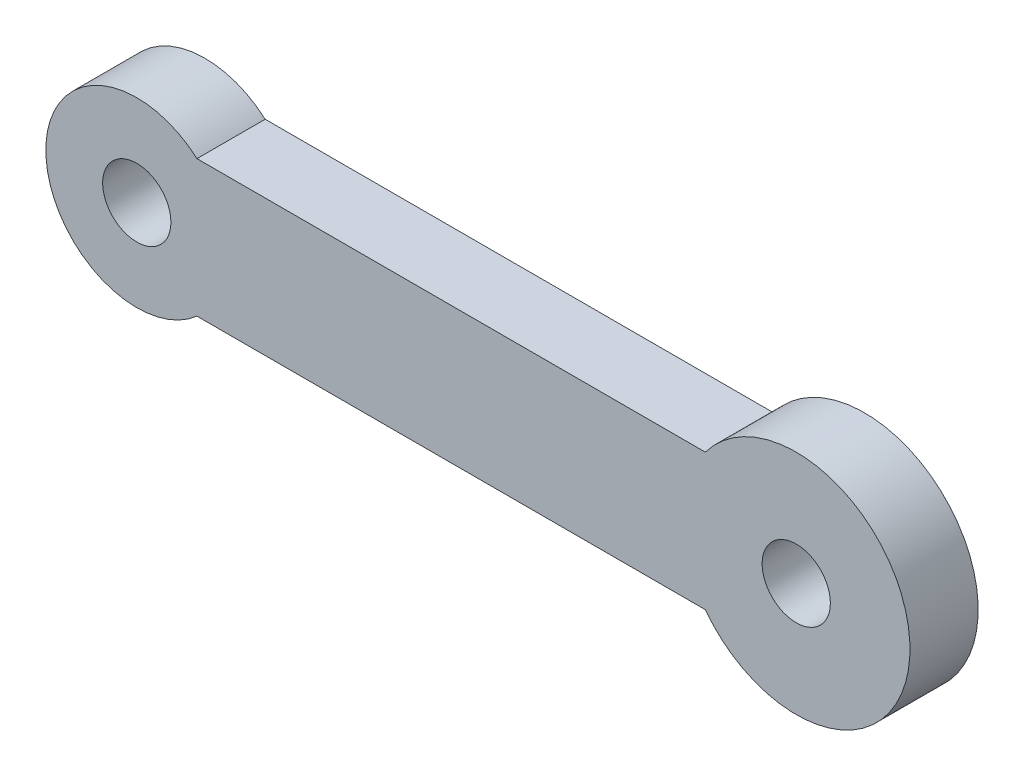
ISO-10303-21;
HEADER;
FILE_DESCRIPTION(('STEP AP214'),'2;1');
FILE_NAME('part.step','',(''),(''),'','','');
FILE_SCHEMA(('AUTOMOTIVE_DESIGN { 1 0 10303 214 1 1 1 1 }'));
ENDSEC;
DATA;
#1=APPLICATION_CONTEXT('core data for automotive mechanical design processes');
#2=APPLICATION_PROTOCOL_DEFINITION('international standard','automotive_design',2000,#1);
#3=PRODUCT_CONTEXT('',#1,'mechanical');
#4=PRODUCT('Part','Part','',(#3));
#5=PRODUCT_RELATED_PRODUCT_CATEGORY('part','',(#4));
#6=PRODUCT_DEFINITION_FORMATION('','',#4);
#7=PRODUCT_DEFINITION_CONTEXT('part definition',#1,'design');
#8=PRODUCT_DEFINITION('design','',#6,#7);
#9=PRODUCT_DEFINITION_SHAPE('','',#8);
#10=(LENGTH_UNIT() NAMED_UNIT(*) SI_UNIT(.MILLI.,.METRE.));
#11=(NAMED_UNIT(*) PLANE_ANGLE_UNIT() SI_UNIT($,.RADIAN.));
#12=(NAMED_UNIT(*) SI_UNIT($,.STERADIAN.) SOLID_ANGLE_UNIT());
#13=UNCERTAINTY_MEASURE_WITH_UNIT(LENGTH_MEASURE(1.E-05),#10,'distance_accuracy_value','');
#14=(GEOMETRIC_REPRESENTATION_CONTEXT(3) GLOBAL_UNCERTAINTY_ASSIGNED_CONTEXT((#13)) GLOBAL_UNIT_ASSIGNED_CONTEXT((#10,
#11,#12)) REPRESENTATION_CONTEXT('',''));
#15=CARTESIAN_POINT('',(0.,0.,0.));
#16=DIRECTION('',(0.,0.,1.));
#17=DIRECTION('',(1.,0.,0.));
#18=AXIS2_PLACEMENT_3D('',#15,#16,#17);
#19=CARTESIAN_POINT('',(0.,0.,3.));
#20=DIRECTION('',(0.,0.,-1.));
#21=DIRECTION('',(-1.,0.,0.));
#22=AXIS2_PLACEMENT_3D('',#19,#20,#21);
#23=CYLINDRICAL_SURFACE('',#22,4.);
#24=CARTESIAN_POINT('',(0.,0.,0.));
#25=DIRECTION('',(0.,0.,1.));
#26=DIRECTION('',(1.,0.,0.));
#27=AXIS2_PLACEMENT_3D('',#24,#25,#26);
#28=CIRCLE('',#27,4.);
#29=CARTESIAN_POINT('',(2.64575131106459,3.,0.));
#30=VERTEX_POINT('',#29);
#31=CARTESIAN_POINT('',(2.64575131106459,-3.,0.));
#32=VERTEX_POINT('',#31);
#33=EDGE_CURVE('E111',#30,#32,#28,.T.);
#34=ORIENTED_EDGE('',*,*,#33,.T.);
#35=DIRECTION('',(0.,0.,-1.));
#36=VECTOR('',#35,1.);
#37=CARTESIAN_POINT('',(2.64575131106459,-3.,3.));
#38=LINE('',#37,#36);
#39=CARTESIAN_POINT('',(2.64575131106459,-3.,3.));
#40=VERTEX_POINT('',#39);
#41=EDGE_CURVE('E11',#40,#32,#38,.T.);
#42=ORIENTED_EDGE('',*,*,#41,.F.);
#43=CARTESIAN_POINT('',(0.,0.,3.));
#44=DIRECTION('',(0.,0.,1.));
#45=DIRECTION('',(1.,0.,0.));
#46=AXIS2_PLACEMENT_3D('',#43,#44,#45);
#47=CIRCLE('',#46,4.);
#48=CARTESIAN_POINT('',(2.64575131106459,3.,3.));
#49=VERTEX_POINT('',#48);
#50=EDGE_CURVE('E91',#49,#40,#47,.T.);
#51=ORIENTED_EDGE('',*,*,#50,.F.);
#52=DIRECTION('',(0.,0.,-1.));
#53=VECTOR('',#52,1.);
#54=CARTESIAN_POINT('',(2.64575131106459,3.,3.));
#55=LINE('',#54,#53);
#56=EDGE_CURVE('E57',#49,#30,#55,.T.);
#57=ORIENTED_EDGE('',*,*,#56,.T.);
#58=EDGE_LOOP('',(#34,#42,#51,#57));
#59=FACE_BOUND('',#58,.T.);
#60=ADVANCED_FACE('F40',(#59),#23,.T.);
#61=CARTESIAN_POINT('',(0.,-3.,3.));
#62=DIRECTION('',(0.,1.,0.));
#63=DIRECTION('',(0.,0.,1.));
#64=AXIS2_PLACEMENT_3D('',#61,#62,#63);
#65=PLANE('',#64);
#66=DIRECTION('',(1.,0.,0.));
#67=VECTOR('',#66,1.);
#68=CARTESIAN_POINT('',(0.,-3.,0.));
#69=LINE('',#68,#67);
#70=CARTESIAN_POINT('',(25.,-3.,0.));
#71=VERTEX_POINT('',#70);
#72=EDGE_CURVE('E96',#32,#71,#69,.T.);
#73=ORIENTED_EDGE('',*,*,#72,.T.);
#74=DIRECTION('',(0.,0.,-1.));
#75=VECTOR('',#74,1.);
#76=CARTESIAN_POINT('',(25.,-3.,3.));
#77=LINE('',#76,#75);
#78=CARTESIAN_POINT('',(25.,-3.,3.));
#79=VERTEX_POINT('',#78);
#80=EDGE_CURVE('E49',#79,#71,#77,.T.);
#81=ORIENTED_EDGE('',*,*,#80,.F.);
#82=DIRECTION('',(1.,0.,0.));
#83=VECTOR('',#82,1.);
#84=CARTESIAN_POINT('',(0.,-3.,3.));
#85=LINE('',#84,#83);
#86=EDGE_CURVE('E83',#40,#79,#85,.T.);
#87=ORIENTED_EDGE('',*,*,#86,.F.);
#88=ORIENTED_EDGE('',*,*,#41,.T.);
#89=EDGE_LOOP('',(#73,#81,#87,#88));
#90=FACE_BOUND('',#89,.T.);
#91=ADVANCED_FACE('F95',(#90),#65,.F.);
#92=CARTESIAN_POINT('',(29.,0.,3.));
#93=DIRECTION('',(0.,0.,-1.));
#94=DIRECTION('',(-1.,0.,0.));
#95=AXIS2_PLACEMENT_3D('',#92,#93,#94);
#96=CYLINDRICAL_SURFACE('',#95,5.);
#97=CARTESIAN_POINT('',(29.,0.,0.));
#98=DIRECTION('',(0.,0.,1.));
#99=DIRECTION('',(1.,0.,0.));
#100=AXIS2_PLACEMENT_3D('',#97,#98,#99);
#101=CIRCLE('',#100,5.);
#102=CARTESIAN_POINT('',(25.,3.,0.));
#103=VERTEX_POINT('',#102);
#104=EDGE_CURVE('E114',#71,#103,#101,.T.);
#105=ORIENTED_EDGE('',*,*,#104,.T.);
#106=DIRECTION('',(0.,0.,-1.));
#107=VECTOR('',#106,1.);
#108=CARTESIAN_POINT('',(25.,3.,3.));
#109=LINE('',#108,#107);
#110=CARTESIAN_POINT('',(25.,3.,3.));
#111=VERTEX_POINT('',#110);
#112=EDGE_CURVE('E72',#111,#103,#109,.T.);
#113=ORIENTED_EDGE('',*,*,#112,.F.);
#114=CARTESIAN_POINT('',(29.,0.,3.));
#115=DIRECTION('',(0.,0.,1.));
#116=DIRECTION('',(1.,0.,0.));
#117=AXIS2_PLACEMENT_3D('',#114,#115,#116);
#118=CIRCLE('',#117,5.);
#119=EDGE_CURVE('E90',#79,#111,#118,.T.);
#120=ORIENTED_EDGE('',*,*,#119,.F.);
#121=ORIENTED_EDGE('',*,*,#80,.T.);
#122=EDGE_LOOP('',(#105,#113,#120,#121));
#123=FACE_BOUND('',#122,.T.);
#124=ADVANCED_FACE('F99',(#123),#96,.T.);
#125=CARTESIAN_POINT('',(0.,3.,3.));
#126=DIRECTION('',(0.,1.,0.));
#127=DIRECTION('',(0.,0.,1.));
#128=AXIS2_PLACEMENT_3D('',#125,#126,#127);
#129=PLANE('',#128);
#130=DIRECTION('',(1.,0.,0.));
#131=VECTOR('',#130,1.);
#132=CARTESIAN_POINT('',(0.,3.,0.));
#133=LINE('',#132,#131);
#134=EDGE_CURVE('E116',#30,#103,#133,.T.);
#135=ORIENTED_EDGE('',*,*,#134,.F.);
#136=ORIENTED_EDGE('',*,*,#56,.F.);
#137=DIRECTION('',(1.,0.,0.));
#138=VECTOR('',#137,1.);
#139=CARTESIAN_POINT('',(0.,3.,3.));
#140=LINE('',#139,#138);
#141=EDGE_CURVE('E100',#49,#111,#140,.T.);
#142=ORIENTED_EDGE('',*,*,#141,.T.);
#143=ORIENTED_EDGE('',*,*,#112,.T.);
#144=EDGE_LOOP('',(#135,#136,#142,#143));
#145=FACE_BOUND('',#144,.T.);
#146=ADVANCED_FACE('F152',(#145),#129,.T.);
#147=CARTESIAN_POINT('',(29.,0.,3.));
#148=DIRECTION('',(0.,0.,-1.));
#149=DIRECTION('',(-1.,0.,0.));
#150=AXIS2_PLACEMENT_3D('',#147,#148,#149);
#151=CYLINDRICAL_SURFACE('',#150,1.5);
#152=CARTESIAN_POINT('',(29.,0.,3.));
#153=DIRECTION('',(0.,0.,1.));
#154=DIRECTION('',(1.,0.,0.));
#155=AXIS2_PLACEMENT_3D('',#152,#153,#154);
#156=CIRCLE('',#155,1.5);
#157=CARTESIAN_POINT('',(30.5,0.,3.));
#158=VERTEX_POINT('',#157);
#159=EDGE_CURVE('E122',#158,#158,#156,.T.);
#160=ORIENTED_EDGE('',*,*,#159,.T.);
#161=EDGE_LOOP('',(#160));
#162=FACE_BOUND('',#161,.T.);
#163=CARTESIAN_POINT('',(29.,0.,0.));
#164=DIRECTION('',(0.,0.,1.));
#165=DIRECTION('',(1.,0.,0.));
#166=AXIS2_PLACEMENT_3D('',#163,#164,#165);
#167=CIRCLE('',#166,1.5);
#168=CARTESIAN_POINT('',(30.5,0.,0.));
#169=VERTEX_POINT('',#168);
#170=EDGE_CURVE('E108',#169,#169,#167,.T.);
#171=ORIENTED_EDGE('',*,*,#170,.F.);
#172=EDGE_LOOP('',(#171));
#173=FACE_BOUND('',#172,.T.);
#174=ADVANCED_FACE('F42',(#162,#173),#151,.F.);
#175=CARTESIAN_POINT('',(0.,0.,3.));
#176=DIRECTION('',(0.,0.,-1.));
#177=DIRECTION('',(-1.,0.,0.));
#178=AXIS2_PLACEMENT_3D('',#175,#176,#177);
#179=CYLINDRICAL_SURFACE('',#178,1.5);
#180=CARTESIAN_POINT('',(0.,0.,3.));
#181=DIRECTION('',(0.,0.,1.));
#182=DIRECTION('',(1.,0.,0.));
#183=AXIS2_PLACEMENT_3D('',#180,#181,#182);
#184=CIRCLE('',#183,1.5);
#185=CARTESIAN_POINT('',(1.5,0.,3.));
#186=VERTEX_POINT('',#185);
#187=EDGE_CURVE('E102',#186,#186,#184,.T.);
#188=ORIENTED_EDGE('',*,*,#187,.T.);
#189=EDGE_LOOP('',(#188));
#190=FACE_BOUND('',#189,.T.);
#191=CARTESIAN_POINT('',(0.,0.,0.));
#192=DIRECTION('',(0.,0.,1.));
#193=DIRECTION('',(1.,0.,0.));
#194=AXIS2_PLACEMENT_3D('',#191,#192,#193);
#195=CIRCLE('',#194,1.5);
#196=CARTESIAN_POINT('',(1.5,0.,0.));
#197=VERTEX_POINT('',#196);
#198=EDGE_CURVE('E119',#197,#197,#195,.T.);
#199=ORIENTED_EDGE('',*,*,#198,.F.);
#200=EDGE_LOOP('',(#199));
#201=FACE_BOUND('',#200,.T.);
#202=ADVANCED_FACE('F134',(#190,#201),#179,.F.);
#203=CARTESIAN_POINT('',(0.,0.,3.));
#204=DIRECTION('',(0.,0.,1.));
#205=DIRECTION('',(1.,0.,0.));
#206=AXIS2_PLACEMENT_3D('',#203,#204,#205);
#207=PLANE('',#206);
#208=ORIENTED_EDGE('',*,*,#159,.F.);
#209=EDGE_LOOP('',(#208));
#210=FACE_BOUND('',#209,.T.);
#211=ORIENTED_EDGE('',*,*,#50,.T.);
#212=ORIENTED_EDGE('',*,*,#86,.T.);
#213=ORIENTED_EDGE('',*,*,#119,.T.);
#214=ORIENTED_EDGE('',*,*,#141,.F.);
#215=EDGE_LOOP('',(#211,#212,#213,#214));
#216=FACE_BOUND('',#215,.T.);
#217=ORIENTED_EDGE('',*,*,#187,.F.);
#218=EDGE_LOOP('',(#217));
#219=FACE_BOUND('',#218,.T.);
#220=ADVANCED_FACE('F86',(#210,#216,#219),#207,.T.);
#221=CARTESIAN_POINT('',(0.,0.,0.));
#222=DIRECTION('',(0.,0.,1.));
#223=DIRECTION('',(1.,0.,0.));
#224=AXIS2_PLACEMENT_3D('',#221,#222,#223);
#225=PLANE('',#224);
#226=ORIENTED_EDGE('',*,*,#170,.T.);
#227=EDGE_LOOP('',(#226));
#228=FACE_BOUND('',#227,.T.);
#229=ORIENTED_EDGE('',*,*,#33,.F.);
#230=ORIENTED_EDGE('',*,*,#134,.T.);
#231=ORIENTED_EDGE('',*,*,#104,.F.);
#232=ORIENTED_EDGE('',*,*,#72,.F.);
#233=EDGE_LOOP('',(#229,#230,#231,#232));
#234=FACE_BOUND('',#233,.T.);
#235=ORIENTED_EDGE('',*,*,#198,.T.);
#236=EDGE_LOOP('',(#235));
#237=FACE_BOUND('',#236,.T.);
#238=ADVANCED_FACE('F133',(#228,#234,#237),#225,.F.);
#239=CLOSED_SHELL('',(#60,#91,#124,#146,#174,#202,#220,#238));
#240=MANIFOLD_SOLID_BREP('B2',#239);
#241=ADVANCED_BREP_SHAPE_REPRESENTATION('',(#18,#240),#14);
#242=SHAPE_DEFINITION_REPRESENTATION(#9,#241);
ENDSEC;
END-ISO-10303-21;
